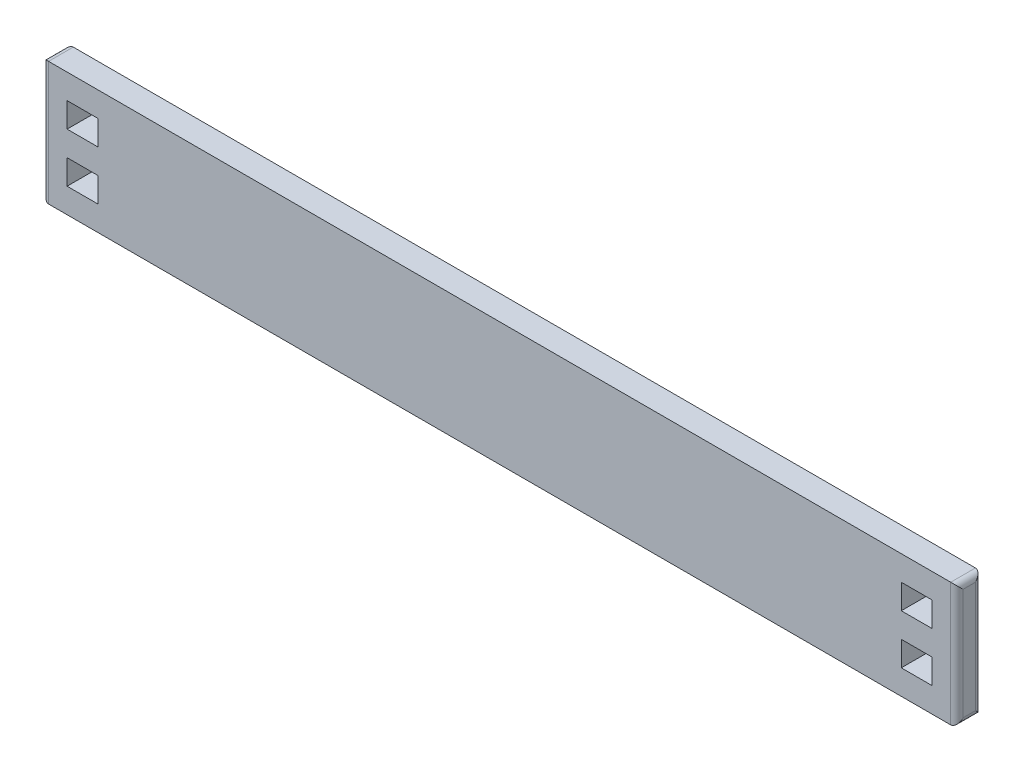
ISO-10303-21;
HEADER;
FILE_DESCRIPTION(('STEP AP214'),'2;1');
FILE_NAME('part.step','',(''),(''),'','','');
FILE_SCHEMA(('AUTOMOTIVE_DESIGN { 1 0 10303 214 1 1 1 1 }'));
ENDSEC;
DATA;
#1=APPLICATION_CONTEXT('core data for automotive mechanical design processes');
#2=APPLICATION_PROTOCOL_DEFINITION('international standard','automotive_design',2000,#1);
#3=PRODUCT_CONTEXT('',#1,'mechanical');
#4=PRODUCT('Part','Part','',(#3));
#5=PRODUCT_RELATED_PRODUCT_CATEGORY('part','',(#4));
#6=PRODUCT_DEFINITION_FORMATION('','',#4);
#7=PRODUCT_DEFINITION_CONTEXT('part definition',#1,'design');
#8=PRODUCT_DEFINITION('design','',#6,#7);
#9=PRODUCT_DEFINITION_SHAPE('','',#8);
#10=(LENGTH_UNIT() NAMED_UNIT(*) SI_UNIT(.MILLI.,.METRE.));
#11=(NAMED_UNIT(*) PLANE_ANGLE_UNIT() SI_UNIT($,.RADIAN.));
#12=(NAMED_UNIT(*) SI_UNIT($,.STERADIAN.) SOLID_ANGLE_UNIT());
#13=UNCERTAINTY_MEASURE_WITH_UNIT(LENGTH_MEASURE(1.E-05),#10,'distance_accuracy_value','');
#14=(GEOMETRIC_REPRESENTATION_CONTEXT(3) GLOBAL_UNCERTAINTY_ASSIGNED_CONTEXT((#13)) GLOBAL_UNIT_ASSIGNED_CONTEXT((#10,
#11,#12)) REPRESENTATION_CONTEXT('',''));
#15=CARTESIAN_POINT('',(0.,0.,0.));
#16=DIRECTION('',(0.,0.,1.));
#17=DIRECTION('',(1.,0.,0.));
#18=AXIS2_PLACEMENT_3D('',#15,#16,#17);
#19=CARTESIAN_POINT('',(0.,0.,4.));
#20=DIRECTION('',(0.,0.,1.));
#21=DIRECTION('',(1.,0.,0.));
#22=AXIS2_PLACEMENT_3D('',#19,#20,#21);
#23=PLANE('',#22);
#24=DIRECTION('',(0.,1.,0.));
#25=VECTOR('',#24,1.);
#26=CARTESIAN_POINT('',(70.,0.,4.));
#27=LINE('',#26,#25);
#28=CARTESIAN_POINT('',(70.,-6.00000000000004,4.));
#29=VERTEX_POINT('',#28);
#30=CARTESIAN_POINT('',(70.,-2.00000000000004,4.));
#31=VERTEX_POINT('',#30);
#32=EDGE_CURVE('E281',#29,#31,#27,.T.);
#33=ORIENTED_EDGE('',*,*,#32,.F.);
#34=DIRECTION('',(-1.,0.,0.));
#35=VECTOR('',#34,1.);
#36=CARTESIAN_POINT('',(0.,-6.00000000000004,4.));
#37=LINE('',#36,#35);
#38=CARTESIAN_POINT('',(65.,-6.00000000000004,4.));
#39=VERTEX_POINT('',#38);
#40=EDGE_CURVE('E293',#29,#39,#37,.T.);
#41=ORIENTED_EDGE('',*,*,#40,.T.);
#42=DIRECTION('',(0.,1.,0.));
#43=VECTOR('',#42,1.);
#44=CARTESIAN_POINT('',(65.,0.,4.));
#45=LINE('',#44,#43);
#46=CARTESIAN_POINT('',(65.,-2.00000000000004,4.));
#47=VERTEX_POINT('',#46);
#48=EDGE_CURVE('E289',#39,#47,#45,.T.);
#49=ORIENTED_EDGE('',*,*,#48,.T.);
#50=DIRECTION('',(-1.,0.,0.));
#51=VECTOR('',#50,1.);
#52=CARTESIAN_POINT('',(0.,-2.00000000000004,4.));
#53=LINE('',#52,#51);
#54=EDGE_CURVE('E284',#31,#47,#53,.T.);
#55=ORIENTED_EDGE('',*,*,#54,.F.);
#56=EDGE_LOOP('',(#33,#41,#49,#55));
#57=FACE_BOUND('',#56,.T.);
#58=DIRECTION('',(1.,0.,0.));
#59=VECTOR('',#58,1.);
#60=CARTESIAN_POINT('',(0.,-9.99999999999999,4.));
#61=LINE('',#60,#59);
#62=CARTESIAN_POINT('',(-73.,-9.99999999999996,4.));
#63=VERTEX_POINT('',#62);
#64=CARTESIAN_POINT('',(73.,-10.,4.));
#65=VERTEX_POINT('',#64);
#66=EDGE_CURVE('E342',#63,#65,#61,.T.);
#67=ORIENTED_EDGE('',*,*,#66,.T.);
#68=DIRECTION('',(0.,1.,0.));
#69=VECTOR('',#68,1.);
#70=CARTESIAN_POINT('',(73.,10.,4.));
#71=LINE('',#70,#69);
#72=CARTESIAN_POINT('',(73.,10.,4.));
#73=VERTEX_POINT('',#72);
#74=EDGE_CURVE('E431',#65,#73,#71,.T.);
#75=ORIENTED_EDGE('',*,*,#74,.T.);
#76=DIRECTION('',(1.,0.,0.));
#77=VECTOR('',#76,1.);
#78=CARTESIAN_POINT('',(0.,10.,4.));
#79=LINE('',#78,#77);
#80=CARTESIAN_POINT('',(-73.,10.,4.));
#81=VERTEX_POINT('',#80);
#82=EDGE_CURVE('E338',#81,#73,#79,.T.);
#83=ORIENTED_EDGE('',*,*,#82,.F.);
#84=DIRECTION('',(0.,1.,0.));
#85=VECTOR('',#84,1.);
#86=CARTESIAN_POINT('',(-73.,0.,4.));
#87=LINE('',#86,#85);
#88=EDGE_CURVE('E428',#81,#63,#87,.F.);
#89=ORIENTED_EDGE('',*,*,#88,.T.);
#90=EDGE_LOOP('',(#67,#75,#83,#89));
#91=FACE_BOUND('',#90,.T.);
#92=DIRECTION('',(1.,0.,0.));
#93=VECTOR('',#92,1.);
#94=CARTESIAN_POINT('',(0.,-6.00000000000004,4.));
#95=LINE('',#94,#93);
#96=CARTESIAN_POINT('',(-70.,-6.00000000000004,4.));
#97=VERTEX_POINT('',#96);
#98=CARTESIAN_POINT('',(-65.,-6.00000000000004,4.));
#99=VERTEX_POINT('',#98);
#100=EDGE_CURVE('E312',#97,#99,#95,.T.);
#101=ORIENTED_EDGE('',*,*,#100,.F.);
#102=DIRECTION('',(0.,1.,0.));
#103=VECTOR('',#102,1.);
#104=CARTESIAN_POINT('',(-70.,0.,4.));
#105=LINE('',#104,#103);
#106=CARTESIAN_POINT('',(-70.,-2.00000000000004,4.));
#107=VERTEX_POINT('',#106);
#108=EDGE_CURVE('E246',#97,#107,#105,.T.);
#109=ORIENTED_EDGE('',*,*,#108,.T.);
#110=DIRECTION('',(1.,0.,0.));
#111=VECTOR('',#110,1.);
#112=CARTESIAN_POINT('',(0.,-2.00000000000004,4.));
#113=LINE('',#112,#111);
#114=CARTESIAN_POINT('',(-65.,-2.00000000000004,4.));
#115=VERTEX_POINT('',#114);
#116=EDGE_CURVE('E320',#107,#115,#113,.T.);
#117=ORIENTED_EDGE('',*,*,#116,.T.);
#118=DIRECTION('',(0.,1.,0.));
#119=VECTOR('',#118,1.);
#120=CARTESIAN_POINT('',(-65.,0.,4.));
#121=LINE('',#120,#119);
#122=EDGE_CURVE('E316',#99,#115,#121,.T.);
#123=ORIENTED_EDGE('',*,*,#122,.F.);
#124=EDGE_LOOP('',(#101,#109,#117,#123));
#125=FACE_BOUND('',#124,.T.);
#126=DIRECTION('',(1.,0.,0.));
#127=VECTOR('',#126,1.);
#128=CARTESIAN_POINT('',(0.,6.00000000000004,4.));
#129=LINE('',#128,#127);
#130=CARTESIAN_POINT('',(-70.,6.00000000000004,4.));
#131=VERTEX_POINT('',#130);
#132=CARTESIAN_POINT('',(-65.,6.00000000000004,4.));
#133=VERTEX_POINT('',#132);
#134=EDGE_CURVE('E226',#131,#133,#129,.T.);
#135=ORIENTED_EDGE('',*,*,#134,.T.);
#136=DIRECTION('',(0.,-1.,0.));
#137=VECTOR('',#136,1.);
#138=CARTESIAN_POINT('',(-65.,0.,4.));
#139=LINE('',#138,#137);
#140=CARTESIAN_POINT('',(-65.,2.00000000000004,4.));
#141=VERTEX_POINT('',#140);
#142=EDGE_CURVE('E232',#133,#141,#139,.T.);
#143=ORIENTED_EDGE('',*,*,#142,.T.);
#144=DIRECTION('',(1.,0.,0.));
#145=VECTOR('',#144,1.);
#146=CARTESIAN_POINT('',(0.,2.00000000000004,4.));
#147=LINE('',#146,#145);
#148=CARTESIAN_POINT('',(-70.,2.00000000000004,4.));
#149=VERTEX_POINT('',#148);
#150=EDGE_CURVE('E236',#149,#141,#147,.T.);
#151=ORIENTED_EDGE('',*,*,#150,.F.);
#152=DIRECTION('',(0.,-1.,0.));
#153=VECTOR('',#152,1.);
#154=CARTESIAN_POINT('',(-70.,0.,4.));
#155=LINE('',#154,#153);
#156=EDGE_CURVE('E214',#131,#149,#155,.T.);
#157=ORIENTED_EDGE('',*,*,#156,.F.);
#158=EDGE_LOOP('',(#135,#143,#151,#157));
#159=FACE_BOUND('',#158,.T.);
#160=DIRECTION('',(-1.,0.,0.));
#161=VECTOR('',#160,1.);
#162=CARTESIAN_POINT('',(0.,6.00000000000004,4.));
#163=LINE('',#162,#161);
#164=CARTESIAN_POINT('',(70.,6.00000000000004,4.));
#165=VERTEX_POINT('',#164);
#166=CARTESIAN_POINT('',(65.,6.00000000000004,4.));
#167=VERTEX_POINT('',#166);
#168=EDGE_CURVE('E255',#165,#167,#163,.T.);
#169=ORIENTED_EDGE('',*,*,#168,.F.);
#170=DIRECTION('',(0.,-1.,0.));
#171=VECTOR('',#170,1.);
#172=CARTESIAN_POINT('',(70.,0.,4.));
#173=LINE('',#172,#171);
#174=CARTESIAN_POINT('',(70.,2.00000000000004,4.));
#175=VERTEX_POINT('',#174);
#176=EDGE_CURVE('E251',#165,#175,#173,.T.);
#177=ORIENTED_EDGE('',*,*,#176,.T.);
#178=DIRECTION('',(-1.,0.,0.));
#179=VECTOR('',#178,1.);
#180=CARTESIAN_POINT('',(0.,2.00000000000004,4.));
#181=LINE('',#180,#179);
#182=CARTESIAN_POINT('',(65.,2.00000000000004,4.));
#183=VERTEX_POINT('',#182);
#184=EDGE_CURVE('E264',#175,#183,#181,.T.);
#185=ORIENTED_EDGE('',*,*,#184,.T.);
#186=DIRECTION('',(0.,-1.,0.));
#187=VECTOR('',#186,1.);
#188=CARTESIAN_POINT('',(65.,0.,4.));
#189=LINE('',#188,#187);
#190=EDGE_CURVE('E260',#167,#183,#189,.T.);
#191=ORIENTED_EDGE('',*,*,#190,.F.);
#192=EDGE_LOOP('',(#169,#177,#185,#191));
#193=FACE_BOUND('',#192,.T.);
#194=ADVANCED_FACE('F47',(#57,#91,#125,#159,#193),#23,.T.);
#195=CARTESIAN_POINT('',(0.,0.,0.));
#196=DIRECTION('',(0.,0.,1.));
#197=DIRECTION('',(1.,0.,0.));
#198=AXIS2_PLACEMENT_3D('',#195,#196,#197);
#199=PLANE('',#198);
#200=DIRECTION('',(-1.,0.,0.));
#201=VECTOR('',#200,1.);
#202=CARTESIAN_POINT('',(0.,-6.00000000000004,0.));
#203=LINE('',#202,#201);
#204=CARTESIAN_POINT('',(70.,-6.00000000000004,0.));
#205=VERTEX_POINT('',#204);
#206=CARTESIAN_POINT('',(65.,-6.00000000000004,0.));
#207=VERTEX_POINT('',#206);
#208=EDGE_CURVE('E401',#205,#207,#203,.T.);
#209=ORIENTED_EDGE('',*,*,#208,.F.);
#210=DIRECTION('',(0.,1.,0.));
#211=VECTOR('',#210,1.);
#212=CARTESIAN_POINT('',(70.,0.,0.));
#213=LINE('',#212,#211);
#214=CARTESIAN_POINT('',(70.,-2.00000000000004,0.));
#215=VERTEX_POINT('',#214);
#216=EDGE_CURVE('E404',#205,#215,#213,.T.);
#217=ORIENTED_EDGE('',*,*,#216,.T.);
#218=DIRECTION('',(-1.,0.,0.));
#219=VECTOR('',#218,1.);
#220=CARTESIAN_POINT('',(0.,-2.00000000000004,0.));
#221=LINE('',#220,#219);
#222=CARTESIAN_POINT('',(65.,-2.00000000000004,0.));
#223=VERTEX_POINT('',#222);
#224=EDGE_CURVE('E393',#215,#223,#221,.T.);
#225=ORIENTED_EDGE('',*,*,#224,.T.);
#226=DIRECTION('',(0.,1.,0.));
#227=VECTOR('',#226,1.);
#228=CARTESIAN_POINT('',(65.,0.,0.));
#229=LINE('',#228,#227);
#230=EDGE_CURVE('E397',#207,#223,#229,.T.);
#231=ORIENTED_EDGE('',*,*,#230,.F.);
#232=EDGE_LOOP('',(#209,#217,#225,#231));
#233=FACE_BOUND('',#232,.T.);
#234=DIRECTION('',(0.,-1.,0.));
#235=VECTOR('',#234,1.);
#236=CARTESIAN_POINT('',(-65.,0.,0.));
#237=LINE('',#236,#235);
#238=CARTESIAN_POINT('',(-65.,6.00000000000004,0.));
#239=VERTEX_POINT('',#238);
#240=CARTESIAN_POINT('',(-65.,2.00000000000004,0.));
#241=VERTEX_POINT('',#240);
#242=EDGE_CURVE('E376',#239,#241,#237,.T.);
#243=ORIENTED_EDGE('',*,*,#242,.F.);
#244=DIRECTION('',(1.,0.,0.));
#245=VECTOR('',#244,1.);
#246=CARTESIAN_POINT('',(0.,6.00000000000004,0.));
#247=LINE('',#246,#245);
#248=CARTESIAN_POINT('',(-70.,6.00000000000004,0.));
#249=VERTEX_POINT('',#248);
#250=EDGE_CURVE('E367',#249,#239,#247,.T.);
#251=ORIENTED_EDGE('',*,*,#250,.F.);
#252=DIRECTION('',(0.,-1.,0.));
#253=VECTOR('',#252,1.);
#254=CARTESIAN_POINT('',(-70.,0.,0.));
#255=LINE('',#254,#253);
#256=CARTESIAN_POINT('',(-70.,2.00000000000004,0.));
#257=VERTEX_POINT('',#256);
#258=EDGE_CURVE('E217',#249,#257,#255,.T.);
#259=ORIENTED_EDGE('',*,*,#258,.T.);
#260=DIRECTION('',(1.,0.,0.));
#261=VECTOR('',#260,1.);
#262=CARTESIAN_POINT('',(0.,2.00000000000004,0.));
#263=LINE('',#262,#261);
#264=EDGE_CURVE('E372',#257,#241,#263,.T.);
#265=ORIENTED_EDGE('',*,*,#264,.T.);
#266=EDGE_LOOP('',(#243,#251,#259,#265));
#267=FACE_BOUND('',#266,.T.);
#268=DIRECTION('',(1.,0.,0.));
#269=VECTOR('',#268,1.);
#270=CARTESIAN_POINT('',(0.,10.,0.));
#271=LINE('',#270,#269);
#272=CARTESIAN_POINT('',(-73.,10.,0.));
#273=VERTEX_POINT('',#272);
#274=CARTESIAN_POINT('',(73.,10.,0.));
#275=VERTEX_POINT('',#274);
#276=EDGE_CURVE('E328',#273,#275,#271,.T.);
#277=ORIENTED_EDGE('',*,*,#276,.T.);
#278=DIRECTION('',(0.,1.,0.));
#279=VECTOR('',#278,1.);
#280=CARTESIAN_POINT('',(73.,0.,0.));
#281=LINE('',#280,#279);
#282=CARTESIAN_POINT('',(73.,-10.,0.));
#283=VERTEX_POINT('',#282);
#284=EDGE_CURVE('E444',#275,#283,#281,.F.);
#285=ORIENTED_EDGE('',*,*,#284,.T.);
#286=DIRECTION('',(1.,0.,0.));
#287=VECTOR('',#286,1.);
#288=CARTESIAN_POINT('',(0.,-9.99999999999999,0.));
#289=LINE('',#288,#287);
#290=CARTESIAN_POINT('',(-73.,-9.99999999999996,0.));
#291=VERTEX_POINT('',#290);
#292=EDGE_CURVE('E343',#291,#283,#289,.T.);
#293=ORIENTED_EDGE('',*,*,#292,.F.);
#294=DIRECTION('',(0.,1.,0.));
#295=VECTOR('',#294,1.);
#296=CARTESIAN_POINT('',(-73.,10.,0.));
#297=LINE('',#296,#295);
#298=EDGE_CURVE('E441',#291,#273,#297,.T.);
#299=ORIENTED_EDGE('',*,*,#298,.T.);
#300=EDGE_LOOP('',(#277,#285,#293,#299));
#301=FACE_BOUND('',#300,.T.);
#302=DIRECTION('',(0.,1.,0.));
#303=VECTOR('',#302,1.);
#304=CARTESIAN_POINT('',(-70.,0.,0.));
#305=LINE('',#304,#303);
#306=CARTESIAN_POINT('',(-70.,-6.00000000000004,0.));
#307=VERTEX_POINT('',#306);
#308=CARTESIAN_POINT('',(-70.,-2.00000000000004,0.));
#309=VERTEX_POINT('',#308);
#310=EDGE_CURVE('E364',#307,#309,#305,.T.);
#311=ORIENTED_EDGE('',*,*,#310,.F.);
#312=DIRECTION('',(1.,0.,0.));
#313=VECTOR('',#312,1.);
#314=CARTESIAN_POINT('',(0.,-6.00000000000004,0.));
#315=LINE('',#314,#313);
#316=CARTESIAN_POINT('',(-65.,-6.00000000000004,0.));
#317=VERTEX_POINT('',#316);
#318=EDGE_CURVE('E347',#307,#317,#315,.T.);
#319=ORIENTED_EDGE('',*,*,#318,.T.);
#320=DIRECTION('',(0.,1.,0.));
#321=VECTOR('',#320,1.);
#322=CARTESIAN_POINT('',(-65.,0.,0.));
#323=LINE('',#322,#321);
#324=CARTESIAN_POINT('',(-65.,-2.00000000000004,0.));
#325=VERTEX_POINT('',#324);
#326=EDGE_CURVE('E357',#317,#325,#323,.T.);
#327=ORIENTED_EDGE('',*,*,#326,.T.);
#328=DIRECTION('',(1.,0.,0.));
#329=VECTOR('',#328,1.);
#330=CARTESIAN_POINT('',(0.,-2.00000000000004,0.));
#331=LINE('',#330,#329);
#332=EDGE_CURVE('E361',#309,#325,#331,.T.);
#333=ORIENTED_EDGE('',*,*,#332,.F.);
#334=EDGE_LOOP('',(#311,#319,#327,#333));
#335=FACE_BOUND('',#334,.T.);
#336=DIRECTION('',(0.,-1.,0.));
#337=VECTOR('',#336,1.);
#338=CARTESIAN_POINT('',(70.,0.,0.));
#339=LINE('',#338,#337);
#340=CARTESIAN_POINT('',(70.,6.00000000000004,0.));
#341=VERTEX_POINT('',#340);
#342=CARTESIAN_POINT('',(70.,2.00000000000004,0.));
#343=VERTEX_POINT('',#342);
#344=EDGE_CURVE('E390',#341,#343,#339,.T.);
#345=ORIENTED_EDGE('',*,*,#344,.F.);
#346=DIRECTION('',(-1.,0.,0.));
#347=VECTOR('',#346,1.);
#348=CARTESIAN_POINT('',(0.,6.00000000000004,0.));
#349=LINE('',#348,#347);
#350=CARTESIAN_POINT('',(65.,6.00000000000004,0.));
#351=VERTEX_POINT('',#350);
#352=EDGE_CURVE('E379',#341,#351,#349,.T.);
#353=ORIENTED_EDGE('',*,*,#352,.T.);
#354=DIRECTION('',(0.,-1.,0.));
#355=VECTOR('',#354,1.);
#356=CARTESIAN_POINT('',(65.,0.,0.));
#357=LINE('',#356,#355);
#358=CARTESIAN_POINT('',(65.,2.00000000000004,0.));
#359=VERTEX_POINT('',#358);
#360=EDGE_CURVE('E383',#351,#359,#357,.T.);
#361=ORIENTED_EDGE('',*,*,#360,.T.);
#362=DIRECTION('',(-1.,0.,0.));
#363=VECTOR('',#362,1.);
#364=CARTESIAN_POINT('',(0.,2.00000000000004,0.));
#365=LINE('',#364,#363);
#366=EDGE_CURVE('E387',#343,#359,#365,.T.);
#367=ORIENTED_EDGE('',*,*,#366,.F.);
#368=EDGE_LOOP('',(#345,#353,#361,#367));
#369=FACE_BOUND('',#368,.T.);
#370=ADVANCED_FACE('F492',(#233,#267,#301,#335,#369),#199,.F.);
#371=CARTESIAN_POINT('',(0.,10.,4.));
#372=DIRECTION('',(0.,1.,0.));
#373=DIRECTION('',(0.,0.,1.));
#374=AXIS2_PLACEMENT_3D('',#371,#372,#373);
#375=PLANE('',#374);
#376=ORIENTED_EDGE('',*,*,#82,.T.);
#377=DIRECTION('',(0.,0.,-1.));
#378=VECTOR('',#377,1.);
#379=CARTESIAN_POINT('',(73.,10.,0.));
#380=LINE('',#379,#378);
#381=EDGE_CURVE('E438',#73,#275,#380,.T.);
#382=ORIENTED_EDGE('',*,*,#381,.T.);
#383=ORIENTED_EDGE('',*,*,#276,.F.);
#384=DIRECTION('',(0.,0.,-1.));
#385=VECTOR('',#384,1.);
#386=CARTESIAN_POINT('',(-73.,10.,4.));
#387=LINE('',#386,#385);
#388=EDGE_CURVE('E434',#273,#81,#387,.F.);
#389=ORIENTED_EDGE('',*,*,#388,.T.);
#390=EDGE_LOOP('',(#376,#382,#383,#389));
#391=FACE_BOUND('',#390,.T.);
#392=ADVANCED_FACE('F511',(#391),#375,.T.);
#393=CARTESIAN_POINT('',(-74.,0.,4.));
#394=DIRECTION('',(-1.,0.,0.));
#395=DIRECTION('',(0.,0.,1.));
#396=AXIS2_PLACEMENT_3D('',#393,#394,#395);
#397=PLANE('',#396);
#398=DIRECTION('',(0.,1.,0.));
#399=VECTOR('',#398,1.);
#400=CARTESIAN_POINT('',(-74.,0.,3.));
#401=LINE('',#400,#399);
#402=CARTESIAN_POINT('',(-74.,-8.99999999999996,3.));
#403=VERTEX_POINT('',#402);
#404=CARTESIAN_POINT('',(-74.,9.00000000000004,3.));
#405=VERTEX_POINT('',#404);
#406=EDGE_CURVE('E57',#403,#405,#401,.T.);
#407=ORIENTED_EDGE('',*,*,#406,.T.);
#408=DIRECTION('',(0.,0.,-1.));
#409=VECTOR('',#408,1.);
#410=CARTESIAN_POINT('',(-74.,9.00000000000004,4.));
#411=LINE('',#410,#409);
#412=CARTESIAN_POINT('',(-74.,9.00000000000004,1.));
#413=VERTEX_POINT('',#412);
#414=EDGE_CURVE('E11',#405,#413,#411,.T.);
#415=ORIENTED_EDGE('',*,*,#414,.T.);
#416=DIRECTION('',(0.,1.,0.));
#417=VECTOR('',#416,1.);
#418=CARTESIAN_POINT('',(-74.,-9.99999999999996,1.));
#419=LINE('',#418,#417);
#420=CARTESIAN_POINT('',(-74.,-8.99999999999996,1.));
#421=VERTEX_POINT('',#420);
#422=EDGE_CURVE('E447',#413,#421,#419,.F.);
#423=ORIENTED_EDGE('',*,*,#422,.T.);
#424=DIRECTION('',(0.,0.,-1.));
#425=VECTOR('',#424,1.);
#426=CARTESIAN_POINT('',(-74.,-8.99999999999996,4.));
#427=LINE('',#426,#425);
#428=EDGE_CURVE('E68',#421,#403,#427,.F.);
#429=ORIENTED_EDGE('',*,*,#428,.T.);
#430=EDGE_LOOP('',(#407,#415,#423,#429));
#431=FACE_BOUND('',#430,.T.);
#432=ADVANCED_FACE('F533',(#431),#397,.T.);
#433=CARTESIAN_POINT('',(0.,-9.99999999999999,4.));
#434=DIRECTION('',(0.,1.,0.));
#435=DIRECTION('',(-1.,0.,0.));
#436=AXIS2_PLACEMENT_3D('',#433,#434,#435);
#437=PLANE('',#436);
#438=ORIENTED_EDGE('',*,*,#292,.T.);
#439=DIRECTION('',(0.,0.,-1.));
#440=VECTOR('',#439,1.);
#441=CARTESIAN_POINT('',(73.,-10.,4.));
#442=LINE('',#441,#440);
#443=EDGE_CURVE('E424',#283,#65,#442,.F.);
#444=ORIENTED_EDGE('',*,*,#443,.T.);
#445=ORIENTED_EDGE('',*,*,#66,.F.);
#446=DIRECTION('',(0.,0.,-1.));
#447=VECTOR('',#446,1.);
#448=CARTESIAN_POINT('',(-73.,-9.99999999999996,0.));
#449=LINE('',#448,#447);
#450=EDGE_CURVE('E421',#63,#291,#449,.T.);
#451=ORIENTED_EDGE('',*,*,#450,.T.);
#452=EDGE_LOOP('',(#438,#444,#445,#451));
#453=FACE_BOUND('',#452,.T.);
#454=ADVANCED_FACE('F489',(#453),#437,.F.);
#455=CARTESIAN_POINT('',(74.,0.,4.));
#456=DIRECTION('',(-1.,0.,0.));
#457=DIRECTION('',(0.,0.,1.));
#458=AXIS2_PLACEMENT_3D('',#455,#456,#457);
#459=PLANE('',#458);
#460=DIRECTION('',(0.,1.,0.));
#461=VECTOR('',#460,1.);
#462=CARTESIAN_POINT('',(74.,-10.,3.));
#463=LINE('',#462,#461);
#464=CARTESIAN_POINT('',(74.,9.00000000000004,3.));
#465=VERTEX_POINT('',#464);
#466=CARTESIAN_POINT('',(74.,-9.00000000000003,3.));
#467=VERTEX_POINT('',#466);
#468=EDGE_CURVE('E414',#465,#467,#463,.F.);
#469=ORIENTED_EDGE('',*,*,#468,.T.);
#470=DIRECTION('',(0.,0.,-1.));
#471=VECTOR('',#470,1.);
#472=CARTESIAN_POINT('',(74.,-9.00000000000003,4.));
#473=LINE('',#472,#471);
#474=CARTESIAN_POINT('',(74.,-9.00000000000003,1.));
#475=VERTEX_POINT('',#474);
#476=EDGE_CURVE('E417',#467,#475,#473,.T.);
#477=ORIENTED_EDGE('',*,*,#476,.T.);
#478=DIRECTION('',(0.,1.,0.));
#479=VECTOR('',#478,1.);
#480=CARTESIAN_POINT('',(74.,0.,1.));
#481=LINE('',#480,#479);
#482=CARTESIAN_POINT('',(74.,9.00000000000004,1.));
#483=VERTEX_POINT('',#482);
#484=EDGE_CURVE('E408',#475,#483,#481,.T.);
#485=ORIENTED_EDGE('',*,*,#484,.T.);
#486=DIRECTION('',(0.,0.,-1.));
#487=VECTOR('',#486,1.);
#488=CARTESIAN_POINT('',(74.,9.00000000000004,4.));
#489=LINE('',#488,#487);
#490=EDGE_CURVE('E411',#483,#465,#489,.F.);
#491=ORIENTED_EDGE('',*,*,#490,.T.);
#492=EDGE_LOOP('',(#469,#477,#485,#491));
#493=FACE_BOUND('',#492,.T.);
#494=ADVANCED_FACE('F521',(#493),#459,.F.);
#495=CARTESIAN_POINT('',(-70.,0.,-1.));
#496=DIRECTION('',(1.,0.,0.));
#497=DIRECTION('',(0.,0.,-1.));
#498=AXIS2_PLACEMENT_3D('',#495,#496,#497);
#499=PLANE('',#498);
#500=ORIENTED_EDGE('',*,*,#310,.T.);
#501=DIRECTION('',(0.,0.,1.));
#502=VECTOR('',#501,1.);
#503=CARTESIAN_POINT('',(-70.,-2.00000000000004,-1.));
#504=LINE('',#503,#502);
#505=EDGE_CURVE('E325',#309,#107,#504,.T.);
#506=ORIENTED_EDGE('',*,*,#505,.T.);
#507=ORIENTED_EDGE('',*,*,#108,.F.);
#508=DIRECTION('',(0.,0.,1.));
#509=VECTOR('',#508,1.);
#510=CARTESIAN_POINT('',(-70.,-6.00000000000004,-1.));
#511=LINE('',#510,#509);
#512=EDGE_CURVE('E324',#307,#97,#511,.T.);
#513=ORIENTED_EDGE('',*,*,#512,.F.);
#514=EDGE_LOOP('',(#500,#506,#507,#513));
#515=FACE_BOUND('',#514,.T.);
#516=ADVANCED_FACE('F523',(#515),#499,.T.);
#517=CARTESIAN_POINT('',(0.,-2.00000000000004,-1.));
#518=DIRECTION('',(0.,-1.,0.));
#519=DIRECTION('',(0.,0.,-1.));
#520=AXIS2_PLACEMENT_3D('',#517,#518,#519);
#521=PLANE('',#520);
#522=ORIENTED_EDGE('',*,*,#332,.T.);
#523=DIRECTION('',(0.,0.,1.));
#524=VECTOR('',#523,1.);
#525=CARTESIAN_POINT('',(-65.,-2.00000000000004,-1.));
#526=LINE('',#525,#524);
#527=EDGE_CURVE('E329',#325,#115,#526,.T.);
#528=ORIENTED_EDGE('',*,*,#527,.T.);
#529=ORIENTED_EDGE('',*,*,#116,.F.);
#530=ORIENTED_EDGE('',*,*,#505,.F.);
#531=EDGE_LOOP('',(#522,#528,#529,#530));
#532=FACE_BOUND('',#531,.T.);
#533=ADVANCED_FACE('F530',(#532),#521,.T.);
#534=CARTESIAN_POINT('',(-65.,0.,-1.));
#535=DIRECTION('',(1.,0.,0.));
#536=DIRECTION('',(0.,0.,-1.));
#537=AXIS2_PLACEMENT_3D('',#534,#535,#536);
#538=PLANE('',#537);
#539=DIRECTION('',(0.,0.,1.));
#540=VECTOR('',#539,1.);
#541=CARTESIAN_POINT('',(-65.,-6.00000000000004,-1.));
#542=LINE('',#541,#540);
#543=EDGE_CURVE('E332',#317,#99,#542,.T.);
#544=ORIENTED_EDGE('',*,*,#543,.T.);
#545=ORIENTED_EDGE('',*,*,#122,.T.);
#546=ORIENTED_EDGE('',*,*,#527,.F.);
#547=ORIENTED_EDGE('',*,*,#326,.F.);
#548=EDGE_LOOP('',(#544,#545,#546,#547));
#549=FACE_BOUND('',#548,.T.);
#550=ADVANCED_FACE('F550',(#549),#538,.F.);
#551=CARTESIAN_POINT('',(0.,-6.00000000000004,-1.));
#552=DIRECTION('',(0.,-1.,0.));
#553=DIRECTION('',(0.,0.,-1.));
#554=AXIS2_PLACEMENT_3D('',#551,#552,#553);
#555=PLANE('',#554);
#556=ORIENTED_EDGE('',*,*,#512,.T.);
#557=ORIENTED_EDGE('',*,*,#100,.T.);
#558=ORIENTED_EDGE('',*,*,#543,.F.);
#559=ORIENTED_EDGE('',*,*,#318,.F.);
#560=EDGE_LOOP('',(#556,#557,#558,#559));
#561=FACE_BOUND('',#560,.T.);
#562=ADVANCED_FACE('F546',(#561),#555,.F.);
#563=CARTESIAN_POINT('',(-65.,0.,-1.));
#564=DIRECTION('',(-1.,0.,0.));
#565=DIRECTION('',(0.,0.,1.));
#566=AXIS2_PLACEMENT_3D('',#563,#564,#565);
#567=PLANE('',#566);
#568=ORIENTED_EDGE('',*,*,#242,.T.);
#569=DIRECTION('',(0.,0.,1.));
#570=VECTOR('',#569,1.);
#571=CARTESIAN_POINT('',(-65.,2.00000000000004,-1.));
#572=LINE('',#571,#570);
#573=EDGE_CURVE('E243',#241,#141,#572,.T.);
#574=ORIENTED_EDGE('',*,*,#573,.T.);
#575=ORIENTED_EDGE('',*,*,#142,.F.);
#576=DIRECTION('',(0.,0.,1.));
#577=VECTOR('',#576,1.);
#578=CARTESIAN_POINT('',(-65.,6.00000000000004,-1.));
#579=LINE('',#578,#577);
#580=EDGE_CURVE('E222',#239,#133,#579,.T.);
#581=ORIENTED_EDGE('',*,*,#580,.F.);
#582=EDGE_LOOP('',(#568,#574,#575,#581));
#583=FACE_BOUND('',#582,.T.);
#584=ADVANCED_FACE('F549',(#583),#567,.T.);
#585=CARTESIAN_POINT('',(0.,2.00000000000004,-1.));
#586=DIRECTION('',(0.,-1.,0.));
#587=DIRECTION('',(0.,0.,-1.));
#588=AXIS2_PLACEMENT_3D('',#585,#586,#587);
#589=PLANE('',#588);
#590=DIRECTION('',(0.,0.,1.));
#591=VECTOR('',#590,1.);
#592=CARTESIAN_POINT('',(-70.,2.00000000000004,-1.));
#593=LINE('',#592,#591);
#594=EDGE_CURVE('E221',#257,#149,#593,.T.);
#595=ORIENTED_EDGE('',*,*,#594,.T.);
#596=ORIENTED_EDGE('',*,*,#150,.T.);
#597=ORIENTED_EDGE('',*,*,#573,.F.);
#598=ORIENTED_EDGE('',*,*,#264,.F.);
#599=EDGE_LOOP('',(#595,#596,#597,#598));
#600=FACE_BOUND('',#599,.T.);
#601=ADVANCED_FACE('F591',(#600),#589,.F.);
#602=CARTESIAN_POINT('',(-70.,0.,-1.));
#603=DIRECTION('',(-1.,0.,0.));
#604=DIRECTION('',(0.,0.,1.));
#605=AXIS2_PLACEMENT_3D('',#602,#603,#604);
#606=PLANE('',#605);
#607=DIRECTION('',(0.,0.,1.));
#608=VECTOR('',#607,1.);
#609=CARTESIAN_POINT('',(-70.,6.00000000000004,-1.));
#610=LINE('',#609,#608);
#611=EDGE_CURVE('E209',#249,#131,#610,.T.);
#612=ORIENTED_EDGE('',*,*,#611,.T.);
#613=ORIENTED_EDGE('',*,*,#156,.T.);
#614=ORIENTED_EDGE('',*,*,#594,.F.);
#615=ORIENTED_EDGE('',*,*,#258,.F.);
#616=EDGE_LOOP('',(#612,#613,#614,#615));
#617=FACE_BOUND('',#616,.T.);
#618=ADVANCED_FACE('F211',(#617),#606,.F.);
#619=CARTESIAN_POINT('',(0.,6.00000000000004,-1.));
#620=DIRECTION('',(0.,-1.,0.));
#621=DIRECTION('',(0.,0.,-1.));
#622=AXIS2_PLACEMENT_3D('',#619,#620,#621);
#623=PLANE('',#622);
#624=ORIENTED_EDGE('',*,*,#250,.T.);
#625=ORIENTED_EDGE('',*,*,#580,.T.);
#626=ORIENTED_EDGE('',*,*,#134,.F.);
#627=ORIENTED_EDGE('',*,*,#611,.F.);
#628=EDGE_LOOP('',(#624,#625,#626,#627));
#629=FACE_BOUND('',#628,.T.);
#630=ADVANCED_FACE('F227',(#629),#623,.T.);
#631=CARTESIAN_POINT('',(70.,0.,-1.));
#632=DIRECTION('',(-1.,0.,0.));
#633=DIRECTION('',(0.,0.,1.));
#634=AXIS2_PLACEMENT_3D('',#631,#632,#633);
#635=PLANE('',#634);
#636=ORIENTED_EDGE('',*,*,#344,.T.);
#637=DIRECTION('',(0.,0.,1.));
#638=VECTOR('',#637,1.);
#639=CARTESIAN_POINT('',(70.,2.00000000000004,-1.));
#640=LINE('',#639,#638);
#641=EDGE_CURVE('E269',#343,#175,#640,.T.);
#642=ORIENTED_EDGE('',*,*,#641,.T.);
#643=ORIENTED_EDGE('',*,*,#176,.F.);
#644=DIRECTION('',(0.,0.,1.));
#645=VECTOR('',#644,1.);
#646=CARTESIAN_POINT('',(70.,6.00000000000004,-1.));
#647=LINE('',#646,#645);
#648=EDGE_CURVE('E268',#341,#165,#647,.T.);
#649=ORIENTED_EDGE('',*,*,#648,.F.);
#650=EDGE_LOOP('',(#636,#642,#643,#649));
#651=FACE_BOUND('',#650,.T.);
#652=ADVANCED_FACE('F574',(#651),#635,.T.);
#653=CARTESIAN_POINT('',(0.,2.00000000000004,-1.));
#654=DIRECTION('',(0.,1.,0.));
#655=DIRECTION('',(0.,0.,1.));
#656=AXIS2_PLACEMENT_3D('',#653,#654,#655);
#657=PLANE('',#656);
#658=ORIENTED_EDGE('',*,*,#366,.T.);
#659=DIRECTION('',(0.,0.,1.));
#660=VECTOR('',#659,1.);
#661=CARTESIAN_POINT('',(65.,2.00000000000004,-1.));
#662=LINE('',#661,#660);
#663=EDGE_CURVE('E272',#359,#183,#662,.T.);
#664=ORIENTED_EDGE('',*,*,#663,.T.);
#665=ORIENTED_EDGE('',*,*,#184,.F.);
#666=ORIENTED_EDGE('',*,*,#641,.F.);
#667=EDGE_LOOP('',(#658,#664,#665,#666));
#668=FACE_BOUND('',#667,.T.);
#669=ADVANCED_FACE('F577',(#668),#657,.T.);
#670=CARTESIAN_POINT('',(65.,0.,-1.));
#671=DIRECTION('',(-1.,0.,0.));
#672=DIRECTION('',(0.,0.,1.));
#673=AXIS2_PLACEMENT_3D('',#670,#671,#672);
#674=PLANE('',#673);
#675=DIRECTION('',(0.,0.,1.));
#676=VECTOR('',#675,1.);
#677=CARTESIAN_POINT('',(65.,6.00000000000004,-1.));
#678=LINE('',#677,#676);
#679=EDGE_CURVE('E275',#351,#167,#678,.T.);
#680=ORIENTED_EDGE('',*,*,#679,.T.);
#681=ORIENTED_EDGE('',*,*,#190,.T.);
#682=ORIENTED_EDGE('',*,*,#663,.F.);
#683=ORIENTED_EDGE('',*,*,#360,.F.);
#684=EDGE_LOOP('',(#680,#681,#682,#683));
#685=FACE_BOUND('',#684,.T.);
#686=ADVANCED_FACE('F581',(#685),#674,.F.);
#687=CARTESIAN_POINT('',(0.,6.00000000000004,-1.));
#688=DIRECTION('',(0.,1.,0.));
#689=DIRECTION('',(0.,0.,1.));
#690=AXIS2_PLACEMENT_3D('',#687,#688,#689);
#691=PLANE('',#690);
#692=ORIENTED_EDGE('',*,*,#648,.T.);
#693=ORIENTED_EDGE('',*,*,#168,.T.);
#694=ORIENTED_EDGE('',*,*,#679,.F.);
#695=ORIENTED_EDGE('',*,*,#352,.F.);
#696=EDGE_LOOP('',(#692,#693,#694,#695));
#697=FACE_BOUND('',#696,.T.);
#698=ADVANCED_FACE('F562',(#697),#691,.F.);
#699=CARTESIAN_POINT('',(70.,0.,-1.));
#700=DIRECTION('',(1.,0.,0.));
#701=DIRECTION('',(0.,0.,-1.));
#702=AXIS2_PLACEMENT_3D('',#699,#700,#701);
#703=PLANE('',#702);
#704=DIRECTION('',(0.,0.,1.));
#705=VECTOR('',#704,1.);
#706=CARTESIAN_POINT('',(70.,-6.00000000000004,-1.));
#707=LINE('',#706,#705);
#708=EDGE_CURVE('E256',#205,#29,#707,.T.);
#709=ORIENTED_EDGE('',*,*,#708,.T.);
#710=ORIENTED_EDGE('',*,*,#32,.T.);
#711=DIRECTION('',(0.,0.,1.));
#712=VECTOR('',#711,1.);
#713=CARTESIAN_POINT('',(70.,-2.00000000000004,-1.));
#714=LINE('',#713,#712);
#715=EDGE_CURVE('E297',#215,#31,#714,.T.);
#716=ORIENTED_EDGE('',*,*,#715,.F.);
#717=ORIENTED_EDGE('',*,*,#216,.F.);
#718=EDGE_LOOP('',(#709,#710,#716,#717));
#719=FACE_BOUND('',#718,.T.);
#720=ADVANCED_FACE('F558',(#719),#703,.F.);
#721=CARTESIAN_POINT('',(0.,-6.00000000000004,-1.));
#722=DIRECTION('',(0.,1.,0.));
#723=DIRECTION('',(0.,0.,1.));
#724=AXIS2_PLACEMENT_3D('',#721,#722,#723);
#725=PLANE('',#724);
#726=ORIENTED_EDGE('',*,*,#208,.T.);
#727=DIRECTION('',(0.,0.,1.));
#728=VECTOR('',#727,1.);
#729=CARTESIAN_POINT('',(65.,-6.00000000000004,-1.));
#730=LINE('',#729,#728);
#731=EDGE_CURVE('E300',#207,#39,#730,.T.);
#732=ORIENTED_EDGE('',*,*,#731,.T.);
#733=ORIENTED_EDGE('',*,*,#40,.F.);
#734=ORIENTED_EDGE('',*,*,#708,.F.);
#735=EDGE_LOOP('',(#726,#732,#733,#734));
#736=FACE_BOUND('',#735,.T.);
#737=ADVANCED_FACE('F561',(#736),#725,.T.);
#738=CARTESIAN_POINT('',(65.,0.,-1.));
#739=DIRECTION('',(1.,0.,0.));
#740=DIRECTION('',(0.,0.,-1.));
#741=AXIS2_PLACEMENT_3D('',#738,#739,#740);
#742=PLANE('',#741);
#743=ORIENTED_EDGE('',*,*,#230,.T.);
#744=DIRECTION('',(0.,0.,1.));
#745=VECTOR('',#744,1.);
#746=CARTESIAN_POINT('',(65.,-2.00000000000004,-1.));
#747=LINE('',#746,#745);
#748=EDGE_CURVE('E303',#223,#47,#747,.T.);
#749=ORIENTED_EDGE('',*,*,#748,.T.);
#750=ORIENTED_EDGE('',*,*,#48,.F.);
#751=ORIENTED_EDGE('',*,*,#731,.F.);
#752=EDGE_LOOP('',(#743,#749,#750,#751));
#753=FACE_BOUND('',#752,.T.);
#754=ADVANCED_FACE('F566',(#753),#742,.T.);
#755=CARTESIAN_POINT('',(0.,-2.00000000000004,-1.));
#756=DIRECTION('',(0.,1.,0.));
#757=DIRECTION('',(0.,0.,1.));
#758=AXIS2_PLACEMENT_3D('',#755,#756,#757);
#759=PLANE('',#758);
#760=ORIENTED_EDGE('',*,*,#715,.T.);
#761=ORIENTED_EDGE('',*,*,#54,.T.);
#762=ORIENTED_EDGE('',*,*,#748,.F.);
#763=ORIENTED_EDGE('',*,*,#224,.F.);
#764=EDGE_LOOP('',(#760,#761,#762,#763));
#765=FACE_BOUND('',#764,.T.);
#766=ADVANCED_FACE('F564',(#765),#759,.F.);
#767=CARTESIAN_POINT('',(73.,9.00000000000004,4.));
#768=DIRECTION('',(0.,0.,1.));
#769=DIRECTION('',(1.,0.,0.));
#770=AXIS2_PLACEMENT_3D('',#767,#768,#769);
#771=CYLINDRICAL_SURFACE('',#770,1.);
#772=CARTESIAN_POINT('',(73.,9.00000000000004,1.));
#773=DIRECTION('',(0.,0.707106781186547,0.707106781186547));
#774=DIRECTION('',(0.,0.707106781186547,-0.707106781186547));
#775=AXIS2_PLACEMENT_3D('',#772,#773,#774);
#776=ELLIPSE('',#775,1.41421356237309,1.);
#777=EDGE_CURVE('E460',#275,#483,#776,.F.);
#778=ORIENTED_EDGE('',*,*,#777,.F.);
#779=ORIENTED_EDGE('',*,*,#381,.F.);
#780=CARTESIAN_POINT('',(73.,9.00000000000004,3.));
#781=DIRECTION('',(0.,-0.707106781186547,0.707106781186547));
#782=DIRECTION('',(0.,0.707106781186547,0.707106781186547));
#783=AXIS2_PLACEMENT_3D('',#780,#781,#782);
#784=ELLIPSE('',#783,1.41421356237309,1.);
#785=EDGE_CURVE('E285',#465,#73,#784,.T.);
#786=ORIENTED_EDGE('',*,*,#785,.F.);
#787=ORIENTED_EDGE('',*,*,#490,.F.);
#788=EDGE_LOOP('',(#778,#779,#786,#787));
#789=FACE_BOUND('',#788,.T.);
#790=ADVANCED_FACE('F515',(#789),#771,.T.);
#791=CARTESIAN_POINT('',(73.,0.,3.));
#792=DIRECTION('',(0.,-1.,0.));
#793=DIRECTION('',(0.,0.,-1.));
#794=AXIS2_PLACEMENT_3D('',#791,#792,#793);
#795=CYLINDRICAL_SURFACE('',#794,1.);
#796=ORIENTED_EDGE('',*,*,#785,.T.);
#797=ORIENTED_EDGE('',*,*,#74,.F.);
#798=CARTESIAN_POINT('',(73.,-9.00000000000003,3.));
#799=DIRECTION('',(0.,-0.707106781186547,-0.707106781186547));
#800=DIRECTION('',(0.,-0.707106781186547,0.707106781186547));
#801=AXIS2_PLACEMENT_3D('',#798,#799,#800);
#802=ELLIPSE('',#801,1.41421356237309,1.);
#803=EDGE_CURVE('E457',#467,#65,#802,.T.);
#804=ORIENTED_EDGE('',*,*,#803,.F.);
#805=ORIENTED_EDGE('',*,*,#468,.F.);
#806=EDGE_LOOP('',(#796,#797,#804,#805));
#807=FACE_BOUND('',#806,.T.);
#808=ADVANCED_FACE('F519',(#807),#795,.T.);
#809=CARTESIAN_POINT('',(73.,0.,1.));
#810=DIRECTION('',(0.,1.,0.));
#811=DIRECTION('',(0.,0.,1.));
#812=AXIS2_PLACEMENT_3D('',#809,#810,#811);
#813=CYLINDRICAL_SURFACE('',#812,1.);
#814=ORIENTED_EDGE('',*,*,#777,.T.);
#815=ORIENTED_EDGE('',*,*,#484,.F.);
#816=CARTESIAN_POINT('',(73.,-9.00000000000003,1.));
#817=DIRECTION('',(0.,0.707106781186547,-0.707106781186547));
#818=DIRECTION('',(0.,0.707106781186547,0.707106781186547));
#819=AXIS2_PLACEMENT_3D('',#816,#817,#818);
#820=ELLIPSE('',#819,1.41421356237309,1.);
#821=EDGE_CURVE('E454',#283,#475,#820,.F.);
#822=ORIENTED_EDGE('',*,*,#821,.F.);
#823=ORIENTED_EDGE('',*,*,#284,.F.);
#824=EDGE_LOOP('',(#814,#815,#822,#823));
#825=FACE_BOUND('',#824,.T.);
#826=ADVANCED_FACE('F499',(#825),#813,.T.);
#827=CARTESIAN_POINT('',(73.,-9.00000000000003,4.));
#828=DIRECTION('',(0.,0.,-1.));
#829=DIRECTION('',(-1.,0.,0.));
#830=AXIS2_PLACEMENT_3D('',#827,#828,#829);
#831=CYLINDRICAL_SURFACE('',#830,1.);
#832=ORIENTED_EDGE('',*,*,#803,.T.);
#833=ORIENTED_EDGE('',*,*,#443,.F.);
#834=ORIENTED_EDGE('',*,*,#821,.T.);
#835=ORIENTED_EDGE('',*,*,#476,.F.);
#836=EDGE_LOOP('',(#832,#833,#834,#835));
#837=FACE_BOUND('',#836,.T.);
#838=ADVANCED_FACE('F503',(#837),#831,.T.);
#839=CARTESIAN_POINT('',(-73.,-8.99999999999996,4.));
#840=DIRECTION('',(0.,0.,1.));
#841=DIRECTION('',(1.,0.,0.));
#842=AXIS2_PLACEMENT_3D('',#839,#840,#841);
#843=CYLINDRICAL_SURFACE('',#842,1.);
#844=CARTESIAN_POINT('',(-73.,-8.99999999999996,1.));
#845=DIRECTION('',(0.,-0.707106781186547,0.707106781186547));
#846=DIRECTION('',(0.,-0.707106781186547,-0.707106781186547));
#847=AXIS2_PLACEMENT_3D('',#844,#845,#846);
#848=ELLIPSE('',#847,1.41421356237309,1.);
#849=EDGE_CURVE('E472',#291,#421,#848,.F.);
#850=ORIENTED_EDGE('',*,*,#849,.F.);
#851=ORIENTED_EDGE('',*,*,#450,.F.);
#852=CARTESIAN_POINT('',(-73.,-8.99999999999996,3.));
#853=DIRECTION('',(0.,0.707106781186547,0.707106781186547));
#854=DIRECTION('',(0.,-0.707106781186547,0.707106781186547));
#855=AXIS2_PLACEMENT_3D('',#852,#853,#854);
#856=ELLIPSE('',#855,1.41421356237309,1.);
#857=EDGE_CURVE('E51',#403,#63,#856,.T.);
#858=ORIENTED_EDGE('',*,*,#857,.F.);
#859=ORIENTED_EDGE('',*,*,#428,.F.);
#860=EDGE_LOOP('',(#850,#851,#858,#859));
#861=FACE_BOUND('',#860,.T.);
#862=ADVANCED_FACE('F49',(#861),#843,.T.);
#863=CARTESIAN_POINT('',(-73.,0.,3.));
#864=DIRECTION('',(0.,1.,0.));
#865=DIRECTION('',(0.,0.,1.));
#866=AXIS2_PLACEMENT_3D('',#863,#864,#865);
#867=CYLINDRICAL_SURFACE('',#866,1.);
#868=ORIENTED_EDGE('',*,*,#857,.T.);
#869=ORIENTED_EDGE('',*,*,#88,.F.);
#870=CARTESIAN_POINT('',(-73.,9.00000000000004,3.));
#871=DIRECTION('',(0.,0.707106781186547,-0.707106781186547));
#872=DIRECTION('',(0.,0.707106781186547,0.707106781186547));
#873=AXIS2_PLACEMENT_3D('',#870,#871,#872);
#874=ELLIPSE('',#873,1.41421356237309,1.);
#875=EDGE_CURVE('E470',#405,#81,#874,.T.);
#876=ORIENTED_EDGE('',*,*,#875,.F.);
#877=ORIENTED_EDGE('',*,*,#406,.F.);
#878=EDGE_LOOP('',(#868,#869,#876,#877));
#879=FACE_BOUND('',#878,.T.);
#880=ADVANCED_FACE('F483',(#879),#867,.T.);
#881=CARTESIAN_POINT('',(-73.,0.,1.));
#882=DIRECTION('',(0.,-1.,0.));
#883=DIRECTION('',(0.,0.,-1.));
#884=AXIS2_PLACEMENT_3D('',#881,#882,#883);
#885=CYLINDRICAL_SURFACE('',#884,1.);
#886=ORIENTED_EDGE('',*,*,#849,.T.);
#887=ORIENTED_EDGE('',*,*,#422,.F.);
#888=CARTESIAN_POINT('',(-73.,9.00000000000004,1.));
#889=DIRECTION('',(0.,-0.707106781186547,-0.707106781186547));
#890=DIRECTION('',(0.,-0.707106781186547,0.707106781186547));
#891=AXIS2_PLACEMENT_3D('',#888,#889,#890);
#892=ELLIPSE('',#891,1.41421356237309,1.);
#893=EDGE_CURVE('E467',#273,#413,#892,.F.);
#894=ORIENTED_EDGE('',*,*,#893,.F.);
#895=ORIENTED_EDGE('',*,*,#298,.F.);
#896=EDGE_LOOP('',(#886,#887,#894,#895));
#897=FACE_BOUND('',#896,.T.);
#898=ADVANCED_FACE('F705',(#897),#885,.T.);
#899=CARTESIAN_POINT('',(-73.,9.00000000000004,4.));
#900=DIRECTION('',(0.,0.,-1.));
#901=DIRECTION('',(-1.,0.,0.));
#902=AXIS2_PLACEMENT_3D('',#899,#900,#901);
#903=CYLINDRICAL_SURFACE('',#902,1.);
#904=ORIENTED_EDGE('',*,*,#875,.T.);
#905=ORIENTED_EDGE('',*,*,#388,.F.);
#906=ORIENTED_EDGE('',*,*,#893,.T.);
#907=ORIENTED_EDGE('',*,*,#414,.F.);
#908=EDGE_LOOP('',(#904,#905,#906,#907));
#909=FACE_BOUND('',#908,.T.);
#910=ADVANCED_FACE('F713',(#909),#903,.T.);
#911=CLOSED_SHELL('',(#194,#370,#392,#432,#454,#494,#516,#533,#550,#562,#584,#601,#618,#630,
#652,#669,#686,#698,#720,#737,#754,#766,#790,#808,#826,#838,#862,#880,#898,#910));
#912=MANIFOLD_SOLID_BREP('B2',#911);
#913=ADVANCED_BREP_SHAPE_REPRESENTATION('',(#18,#912),#14);
#914=SHAPE_DEFINITION_REPRESENTATION(#9,#913);
ENDSEC;
END-ISO-10303-21;
